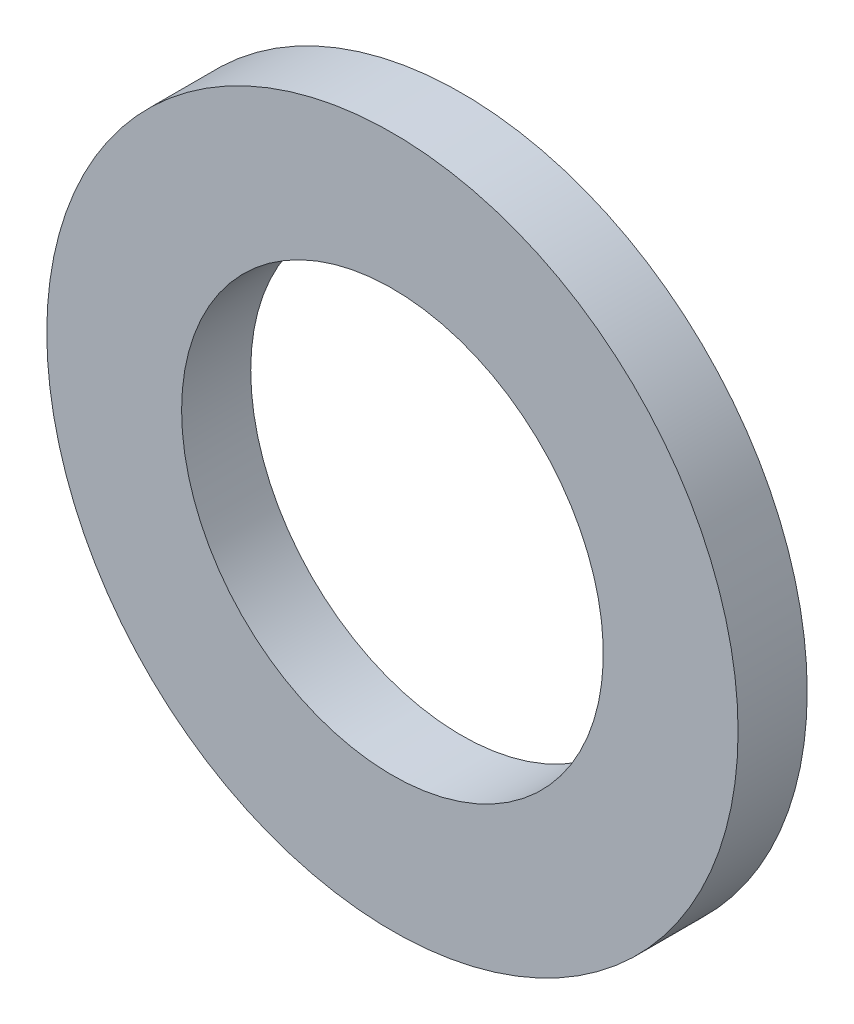
ISO-10303-21;
HEADER;
FILE_DESCRIPTION(('STEP AP214'),'2;1');
FILE_NAME('part.step','',(''),(''),'','','');
FILE_SCHEMA(('AUTOMOTIVE_DESIGN { 1 0 10303 214 1 1 1 1 }'));
ENDSEC;
DATA;
#1=APPLICATION_CONTEXT('core data for automotive mechanical design processes');
#2=APPLICATION_PROTOCOL_DEFINITION('international standard','automotive_design',2000,#1);
#3=PRODUCT_CONTEXT('',#1,'mechanical');
#4=PRODUCT('Part','Part','',(#3));
#5=PRODUCT_RELATED_PRODUCT_CATEGORY('part','',(#4));
#6=PRODUCT_DEFINITION_FORMATION('','',#4);
#7=PRODUCT_DEFINITION_CONTEXT('part definition',#1,'design');
#8=PRODUCT_DEFINITION('design','',#6,#7);
#9=PRODUCT_DEFINITION_SHAPE('','',#8);
#10=(LENGTH_UNIT() NAMED_UNIT(*) SI_UNIT(.MILLI.,.METRE.));
#11=(NAMED_UNIT(*) PLANE_ANGLE_UNIT() SI_UNIT($,.RADIAN.));
#12=(NAMED_UNIT(*) SI_UNIT($,.STERADIAN.) SOLID_ANGLE_UNIT());
#13=UNCERTAINTY_MEASURE_WITH_UNIT(LENGTH_MEASURE(1.E-05),#10,'distance_accuracy_value','');
#14=(GEOMETRIC_REPRESENTATION_CONTEXT(3) GLOBAL_UNCERTAINTY_ASSIGNED_CONTEXT((#13)) GLOBAL_UNIT_ASSIGNED_CONTEXT((#10,
#11,#12)) REPRESENTATION_CONTEXT('',''));
#15=CARTESIAN_POINT('',(0.,0.,0.));
#16=DIRECTION('',(0.,0.,1.));
#17=DIRECTION('',(1.,0.,0.));
#18=AXIS2_PLACEMENT_3D('',#15,#16,#17);
#19=CARTESIAN_POINT('',(1.525,0.,-0.25));
#20=DIRECTION('',(0.,0.,-1.));
#21=DIRECTION('',(-1.,0.,0.));
#22=AXIS2_PLACEMENT_3D('',#19,#20,#21);
#23=PLANE('',#22);
#24=CARTESIAN_POINT('',(0.,0.,-0.25));
#25=DIRECTION('',(0.,0.,-1.));
#26=DIRECTION('',(-1.,0.,0.));
#27=AXIS2_PLACEMENT_3D('',#24,#25,#26);
#28=CIRCLE('',#27,2.5);
#29=CARTESIAN_POINT('',(-2.5,0.,-0.25));
#30=VERTEX_POINT('',#29);
#31=EDGE_CURVE('E10',#30,#30,#28,.T.);
#32=ORIENTED_EDGE('',*,*,#31,.T.);
#33=EDGE_LOOP('',(#32));
#34=FACE_BOUND('',#33,.T.);
#35=CARTESIAN_POINT('',(0.,0.,-0.25));
#36=DIRECTION('',(0.,0.,-1.));
#37=DIRECTION('',(-1.,0.,0.));
#38=AXIS2_PLACEMENT_3D('',#35,#36,#37);
#39=CIRCLE('',#38,1.525);
#40=CARTESIAN_POINT('',(-1.525,0.,-0.25));
#41=VERTEX_POINT('',#40);
#42=EDGE_CURVE('E60',#41,#41,#39,.T.);
#43=ORIENTED_EDGE('',*,*,#42,.F.);
#44=EDGE_LOOP('',(#43));
#45=FACE_BOUND('',#44,.T.);
#46=ADVANCED_FACE('F43',(#34,#45),#23,.T.);
#47=CARTESIAN_POINT('',(0.,0.,0.25));
#48=DIRECTION('',(0.,0.,-1.));
#49=DIRECTION('',(-1.,0.,0.));
#50=AXIS2_PLACEMENT_3D('',#47,#48,#49);
#51=CYLINDRICAL_SURFACE('',#50,2.5);
#52=CARTESIAN_POINT('',(0.,0.,0.25));
#53=DIRECTION('',(0.,0.,-1.));
#54=DIRECTION('',(-1.,0.,0.));
#55=AXIS2_PLACEMENT_3D('',#52,#53,#54);
#56=CIRCLE('',#55,2.5);
#57=CARTESIAN_POINT('',(-2.5,0.,0.25));
#58=VERTEX_POINT('',#57);
#59=EDGE_CURVE('E50',#58,#58,#56,.T.);
#60=ORIENTED_EDGE('',*,*,#59,.T.);
#61=EDGE_LOOP('',(#60));
#62=FACE_BOUND('',#61,.T.);
#63=ORIENTED_EDGE('',*,*,#31,.F.);
#64=EDGE_LOOP('',(#63));
#65=FACE_BOUND('',#64,.T.);
#66=ADVANCED_FACE('F71',(#62,#65),#51,.T.);
#67=CARTESIAN_POINT('',(2.5,0.,0.25));
#68=DIRECTION('',(0.,0.,1.));
#69=DIRECTION('',(1.,0.,0.));
#70=AXIS2_PLACEMENT_3D('',#67,#68,#69);
#71=PLANE('',#70);
#72=CARTESIAN_POINT('',(0.,0.,0.25));
#73=DIRECTION('',(0.,0.,-1.));
#74=DIRECTION('',(-1.,0.,0.));
#75=AXIS2_PLACEMENT_3D('',#72,#73,#74);
#76=CIRCLE('',#75,1.525);
#77=CARTESIAN_POINT('',(-1.525,0.,0.25));
#78=VERTEX_POINT('',#77);
#79=EDGE_CURVE('E55',#78,#78,#76,.T.);
#80=ORIENTED_EDGE('',*,*,#79,.T.);
#81=EDGE_LOOP('',(#80));
#82=FACE_BOUND('',#81,.T.);
#83=ORIENTED_EDGE('',*,*,#59,.F.);
#84=EDGE_LOOP('',(#83));
#85=FACE_BOUND('',#84,.T.);
#86=ADVANCED_FACE('F75',(#82,#85),#71,.T.);
#87=CARTESIAN_POINT('',(0.,0.,0.25));
#88=DIRECTION('',(0.,0.,-1.));
#89=DIRECTION('',(-1.,0.,0.));
#90=AXIS2_PLACEMENT_3D('',#87,#88,#89);
#91=CYLINDRICAL_SURFACE('',#90,1.525);
#92=ORIENTED_EDGE('',*,*,#42,.T.);
#93=EDGE_LOOP('',(#92));
#94=FACE_BOUND('',#93,.T.);
#95=ORIENTED_EDGE('',*,*,#79,.F.);
#96=EDGE_LOOP('',(#95));
#97=FACE_BOUND('',#96,.T.);
#98=ADVANCED_FACE('F67',(#94,#97),#91,.F.);
#99=CLOSED_SHELL('',(#46,#66,#86,#98));
#100=MANIFOLD_SOLID_BREP('B2',#99);
#101=ADVANCED_BREP_SHAPE_REPRESENTATION('',(#18,#100),#14);
#102=SHAPE_DEFINITION_REPRESENTATION(#9,#101);
ENDSEC;
END-ISO-10303-21;
